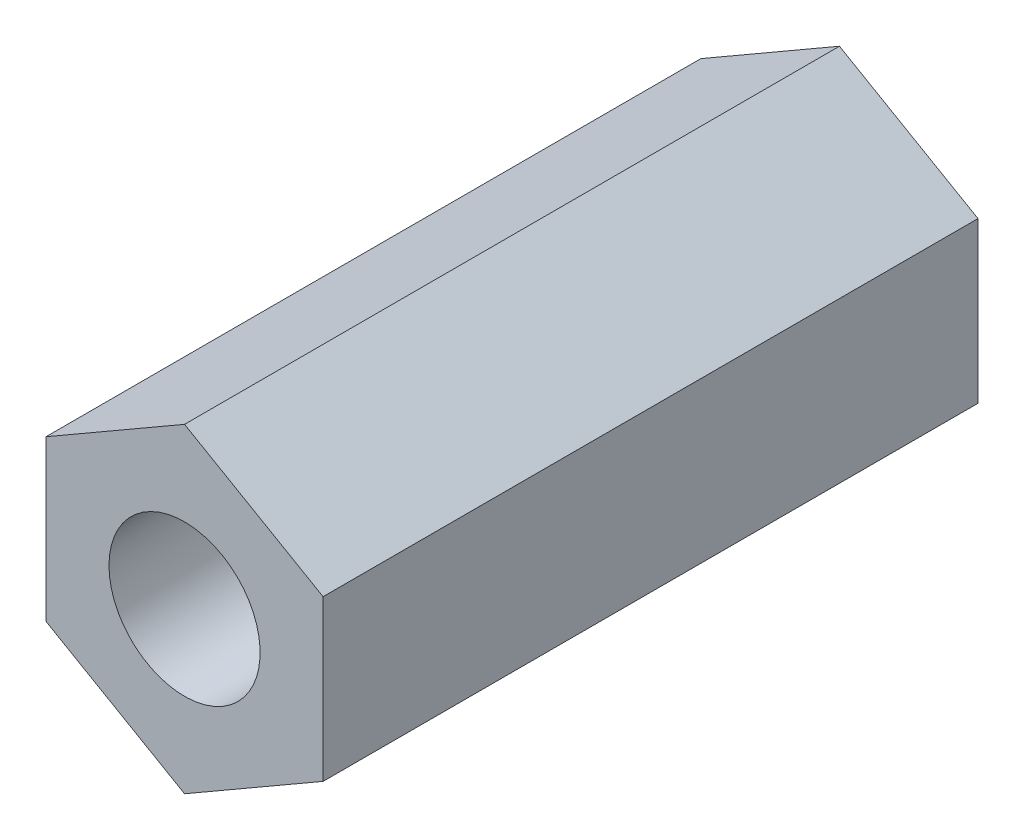
ISO-10303-21;
HEADER;
FILE_DESCRIPTION(('STEP AP214'),'2;1');
FILE_NAME('part.step','',(''),(''),'','','');
FILE_SCHEMA(('AUTOMOTIVE_DESIGN { 1 0 10303 214 1 1 1 1 }'));
ENDSEC;
DATA;
#1=APPLICATION_CONTEXT('core data for automotive mechanical design processes');
#2=APPLICATION_PROTOCOL_DEFINITION('international standard','automotive_design',2000,#1);
#3=PRODUCT_CONTEXT('',#1,'mechanical');
#4=PRODUCT('Part','Part','',(#3));
#5=PRODUCT_RELATED_PRODUCT_CATEGORY('part','',(#4));
#6=PRODUCT_DEFINITION_FORMATION('','',#4);
#7=PRODUCT_DEFINITION_CONTEXT('part definition',#1,'design');
#8=PRODUCT_DEFINITION('design','',#6,#7);
#9=PRODUCT_DEFINITION_SHAPE('','',#8);
#10=(LENGTH_UNIT() NAMED_UNIT(*) SI_UNIT(.MILLI.,.METRE.));
#11=(NAMED_UNIT(*) PLANE_ANGLE_UNIT() SI_UNIT($,.RADIAN.));
#12=(NAMED_UNIT(*) SI_UNIT($,.STERADIAN.) SOLID_ANGLE_UNIT());
#13=UNCERTAINTY_MEASURE_WITH_UNIT(LENGTH_MEASURE(1.E-05),#10,'distance_accuracy_value','');
#14=(GEOMETRIC_REPRESENTATION_CONTEXT(3) GLOBAL_UNCERTAINTY_ASSIGNED_CONTEXT((#13)) GLOBAL_UNIT_ASSIGNED_CONTEXT((#10,
#11,#12)) REPRESENTATION_CONTEXT('',''));
#15=CARTESIAN_POINT('',(0.,0.,0.));
#16=DIRECTION('',(0.,0.,1.));
#17=DIRECTION('',(1.,0.,0.));
#18=AXIS2_PLACEMENT_3D('',#15,#16,#17);
#19=CARTESIAN_POINT('',(0.,0.,13.));
#20=DIRECTION('',(0.,0.,1.));
#21=DIRECTION('',(1.,0.,0.));
#22=AXIS2_PLACEMENT_3D('',#19,#20,#21);
#23=PLANE('',#22);
#24=DIRECTION('',(0.866025403784439,-0.5,0.));
#25=VECTOR('',#24,1.);
#26=CARTESIAN_POINT('',(-2.75,-1.58771324027147,13.));
#27=LINE('',#26,#25);
#28=CARTESIAN_POINT('',(-2.75,-1.58771324027147,13.));
#29=VERTEX_POINT('',#28);
#30=CARTESIAN_POINT('',(0.,-3.17542648054294,13.));
#31=VERTEX_POINT('',#30);
#32=EDGE_CURVE('E148',#29,#31,#27,.T.);
#33=ORIENTED_EDGE('',*,*,#32,.T.);
#34=DIRECTION('',(0.866025403784438,0.5,0.));
#35=VECTOR('',#34,1.);
#36=CARTESIAN_POINT('',(0.,-3.17542648054294,13.));
#37=LINE('',#36,#35);
#38=CARTESIAN_POINT('',(2.75,-1.58771324027147,13.));
#39=VERTEX_POINT('',#38);
#40=EDGE_CURVE('E96',#31,#39,#37,.T.);
#41=ORIENTED_EDGE('',*,*,#40,.T.);
#42=DIRECTION('',(0.,1.,0.));
#43=VECTOR('',#42,1.);
#44=CARTESIAN_POINT('',(2.75,-1.58771324027147,13.));
#45=LINE('',#44,#43);
#46=CARTESIAN_POINT('',(2.75,1.58771324027147,13.));
#47=VERTEX_POINT('',#46);
#48=EDGE_CURVE('E109',#39,#47,#45,.T.);
#49=ORIENTED_EDGE('',*,*,#48,.T.);
#50=DIRECTION('',(-0.866025403784438,0.5,0.));
#51=VECTOR('',#50,1.);
#52=CARTESIAN_POINT('',(2.75,1.58771324027147,13.));
#53=LINE('',#52,#51);
#54=CARTESIAN_POINT('',(0.,3.17542648054294,13.));
#55=VERTEX_POINT('',#54);
#56=EDGE_CURVE('E103',#47,#55,#53,.T.);
#57=ORIENTED_EDGE('',*,*,#56,.T.);
#58=DIRECTION('',(-0.866025403784438,-0.5,0.));
#59=VECTOR('',#58,1.);
#60=CARTESIAN_POINT('',(0.,3.17542648054294,13.));
#61=LINE('',#60,#59);
#62=CARTESIAN_POINT('',(-2.75,1.58771324027147,13.));
#63=VERTEX_POINT('',#62);
#64=EDGE_CURVE('E107',#55,#63,#61,.T.);
#65=ORIENTED_EDGE('',*,*,#64,.T.);
#66=DIRECTION('',(0.,-1.,0.));
#67=VECTOR('',#66,1.);
#68=CARTESIAN_POINT('',(-2.75,1.58771324027147,13.));
#69=LINE('',#68,#67);
#70=EDGE_CURVE('E59',#63,#29,#69,.T.);
#71=ORIENTED_EDGE('',*,*,#70,.T.);
#72=EDGE_LOOP('',(#33,#41,#49,#57,#65,#71));
#73=FACE_BOUND('',#72,.T.);
#74=CARTESIAN_POINT('',(0.,0.,13.));
#75=DIRECTION('',(0.,0.,1.));
#76=DIRECTION('',(1.,0.,0.));
#77=AXIS2_PLACEMENT_3D('',#74,#75,#76);
#78=CIRCLE('',#77,1.5);
#79=CARTESIAN_POINT('',(-1.5,0.,13.));
#80=VERTEX_POINT('',#79);
#81=EDGE_CURVE('E136',#80,#80,#78,.T.);
#82=ORIENTED_EDGE('',*,*,#81,.F.);
#83=EDGE_LOOP('',(#82));
#84=FACE_BOUND('',#83,.T.);
#85=ADVANCED_FACE('F41',(#73,#84),#23,.T.);
#86=CARTESIAN_POINT('',(0.,0.,0.));
#87=DIRECTION('',(0.,0.,1.));
#88=DIRECTION('',(1.,0.,0.));
#89=AXIS2_PLACEMENT_3D('',#86,#87,#88);
#90=PLANE('',#89);
#91=DIRECTION('',(0.866025403784439,-0.5,0.));
#92=VECTOR('',#91,1.);
#93=CARTESIAN_POINT('',(-2.75,-1.58771324027147,0.));
#94=LINE('',#93,#92);
#95=CARTESIAN_POINT('',(-2.75,-1.58771324027147,0.));
#96=VERTEX_POINT('',#95);
#97=CARTESIAN_POINT('',(0.,-3.17542648054294,0.));
#98=VERTEX_POINT('',#97);
#99=EDGE_CURVE('E131',#96,#98,#94,.T.);
#100=ORIENTED_EDGE('',*,*,#99,.F.);
#101=DIRECTION('',(0.,-1.,0.));
#102=VECTOR('',#101,1.);
#103=CARTESIAN_POINT('',(-2.75,1.58771324027147,0.));
#104=LINE('',#103,#102);
#105=CARTESIAN_POINT('',(-2.75,1.58771324027147,0.));
#106=VERTEX_POINT('',#105);
#107=EDGE_CURVE('E88',#106,#96,#104,.T.);
#108=ORIENTED_EDGE('',*,*,#107,.F.);
#109=DIRECTION('',(-0.866025403784438,-0.5,0.));
#110=VECTOR('',#109,1.);
#111=CARTESIAN_POINT('',(0.,3.17542648054294,0.));
#112=LINE('',#111,#110);
#113=CARTESIAN_POINT('',(0.,3.17542648054294,0.));
#114=VERTEX_POINT('',#113);
#115=EDGE_CURVE('E82',#114,#106,#112,.T.);
#116=ORIENTED_EDGE('',*,*,#115,.F.);
#117=DIRECTION('',(-0.866025403784438,0.5,0.));
#118=VECTOR('',#117,1.);
#119=CARTESIAN_POINT('',(2.75,1.58771324027147,0.));
#120=LINE('',#119,#118);
#121=CARTESIAN_POINT('',(2.75,1.58771324027147,0.));
#122=VERTEX_POINT('',#121);
#123=EDGE_CURVE('E118',#122,#114,#120,.T.);
#124=ORIENTED_EDGE('',*,*,#123,.F.);
#125=DIRECTION('',(0.,1.,0.));
#126=VECTOR('',#125,1.);
#127=CARTESIAN_POINT('',(2.75,-1.58771324027147,0.));
#128=LINE('',#127,#126);
#129=CARTESIAN_POINT('',(2.75,-1.58771324027147,0.));
#130=VERTEX_POINT('',#129);
#131=EDGE_CURVE('E139',#130,#122,#128,.T.);
#132=ORIENTED_EDGE('',*,*,#131,.F.);
#133=DIRECTION('',(0.866025403784438,0.5,0.));
#134=VECTOR('',#133,1.);
#135=CARTESIAN_POINT('',(0.,-3.17542648054294,0.));
#136=LINE('',#135,#134);
#137=EDGE_CURVE('E135',#98,#130,#136,.T.);
#138=ORIENTED_EDGE('',*,*,#137,.F.);
#139=EDGE_LOOP('',(#100,#108,#116,#124,#132,#138));
#140=FACE_BOUND('',#139,.T.);
#141=CARTESIAN_POINT('',(0.,0.,0.));
#142=DIRECTION('',(0.,0.,1.));
#143=DIRECTION('',(1.,0.,0.));
#144=AXIS2_PLACEMENT_3D('',#141,#142,#143);
#145=CIRCLE('',#144,1.5);
#146=CARTESIAN_POINT('',(-1.5,0.,0.));
#147=VERTEX_POINT('',#146);
#148=EDGE_CURVE('E245',#147,#147,#145,.T.);
#149=ORIENTED_EDGE('',*,*,#148,.T.);
#150=EDGE_LOOP('',(#149));
#151=FACE_BOUND('',#150,.T.);
#152=ADVANCED_FACE('F161',(#140,#151),#90,.F.);
#153=CARTESIAN_POINT('',(-2.75,-1.58771324027147,13.));
#154=DIRECTION('',(0.5,0.866025403784439,0.));
#155=DIRECTION('',(-0.866025403784439,0.5,0.));
#156=AXIS2_PLACEMENT_3D('',#153,#154,#155);
#157=PLANE('',#156);
#158=ORIENTED_EDGE('',*,*,#99,.T.);
#159=DIRECTION('',(0.,0.,-1.));
#160=VECTOR('',#159,1.);
#161=CARTESIAN_POINT('',(0.,-3.17542648054294,13.));
#162=LINE('',#161,#160);
#163=EDGE_CURVE('E11',#31,#98,#162,.T.);
#164=ORIENTED_EDGE('',*,*,#163,.F.);
#165=ORIENTED_EDGE('',*,*,#32,.F.);
#166=DIRECTION('',(0.,0.,-1.));
#167=VECTOR('',#166,1.);
#168=CARTESIAN_POINT('',(-2.75,-1.58771324027147,13.));
#169=LINE('',#168,#167);
#170=EDGE_CURVE('E127',#29,#96,#169,.T.);
#171=ORIENTED_EDGE('',*,*,#170,.T.);
#172=EDGE_LOOP('',(#158,#164,#165,#171));
#173=FACE_BOUND('',#172,.T.);
#174=ADVANCED_FACE('F43',(#173),#157,.F.);
#175=CARTESIAN_POINT('',(0.,-3.17542648054294,13.));
#176=DIRECTION('',(-0.5,0.866025403784438,0.));
#177=DIRECTION('',(-0.866025403784439,-0.5,0.));
#178=AXIS2_PLACEMENT_3D('',#175,#176,#177);
#179=PLANE('',#178);
#180=ORIENTED_EDGE('',*,*,#137,.T.);
#181=DIRECTION('',(0.,0.,-1.));
#182=VECTOR('',#181,1.);
#183=CARTESIAN_POINT('',(2.75,-1.58771324027147,13.));
#184=LINE('',#183,#182);
#185=EDGE_CURVE('E51',#39,#130,#184,.T.);
#186=ORIENTED_EDGE('',*,*,#185,.F.);
#187=ORIENTED_EDGE('',*,*,#40,.F.);
#188=ORIENTED_EDGE('',*,*,#163,.T.);
#189=EDGE_LOOP('',(#180,#186,#187,#188));
#190=FACE_BOUND('',#189,.T.);
#191=ADVANCED_FACE('F186',(#190),#179,.F.);
#192=CARTESIAN_POINT('',(2.75,-1.58771324027147,13.));
#193=DIRECTION('',(-1.,0.,0.));
#194=DIRECTION('',(0.,0.,1.));
#195=AXIS2_PLACEMENT_3D('',#192,#193,#194);
#196=PLANE('',#195);
#197=ORIENTED_EDGE('',*,*,#131,.T.);
#198=DIRECTION('',(0.,0.,-1.));
#199=VECTOR('',#198,1.);
#200=CARTESIAN_POINT('',(2.75,1.58771324027147,13.));
#201=LINE('',#200,#199);
#202=EDGE_CURVE('E120',#47,#122,#201,.T.);
#203=ORIENTED_EDGE('',*,*,#202,.F.);
#204=ORIENTED_EDGE('',*,*,#48,.F.);
#205=ORIENTED_EDGE('',*,*,#185,.T.);
#206=EDGE_LOOP('',(#197,#203,#204,#205));
#207=FACE_BOUND('',#206,.T.);
#208=ADVANCED_FACE('F158',(#207),#196,.F.);
#209=CARTESIAN_POINT('',(2.75,1.58771324027147,13.));
#210=DIRECTION('',(-0.5,-0.866025403784439,0.));
#211=DIRECTION('',(0.866025403784439,-0.5,0.));
#212=AXIS2_PLACEMENT_3D('',#209,#210,#211);
#213=PLANE('',#212);
#214=ORIENTED_EDGE('',*,*,#123,.T.);
#215=DIRECTION('',(0.,0.,-1.));
#216=VECTOR('',#215,1.);
#217=CARTESIAN_POINT('',(0.,3.17542648054294,13.));
#218=LINE('',#217,#216);
#219=EDGE_CURVE('E115',#55,#114,#218,.T.);
#220=ORIENTED_EDGE('',*,*,#219,.F.);
#221=ORIENTED_EDGE('',*,*,#56,.F.);
#222=ORIENTED_EDGE('',*,*,#202,.T.);
#223=EDGE_LOOP('',(#214,#220,#221,#222));
#224=FACE_BOUND('',#223,.T.);
#225=ADVANCED_FACE('F116',(#224),#213,.F.);
#226=CARTESIAN_POINT('',(0.,3.17542648054294,13.));
#227=DIRECTION('',(0.5,-0.866025403784438,0.));
#228=DIRECTION('',(0.866025403784439,0.5,0.));
#229=AXIS2_PLACEMENT_3D('',#226,#227,#228);
#230=PLANE('',#229);
#231=ORIENTED_EDGE('',*,*,#115,.T.);
#232=DIRECTION('',(0.,0.,-1.));
#233=VECTOR('',#232,1.);
#234=CARTESIAN_POINT('',(-2.75,1.58771324027147,13.));
#235=LINE('',#234,#233);
#236=EDGE_CURVE('E121',#63,#106,#235,.T.);
#237=ORIENTED_EDGE('',*,*,#236,.F.);
#238=ORIENTED_EDGE('',*,*,#64,.F.);
#239=ORIENTED_EDGE('',*,*,#219,.T.);
#240=EDGE_LOOP('',(#231,#237,#238,#239));
#241=FACE_BOUND('',#240,.T.);
#242=ADVANCED_FACE('F123',(#241),#230,.F.);
#243=CARTESIAN_POINT('',(-2.75,1.58771324027147,13.));
#244=DIRECTION('',(1.,0.,0.));
#245=DIRECTION('',(0.,0.,-1.));
#246=AXIS2_PLACEMENT_3D('',#243,#244,#245);
#247=PLANE('',#246);
#248=ORIENTED_EDGE('',*,*,#107,.T.);
#249=ORIENTED_EDGE('',*,*,#170,.F.);
#250=ORIENTED_EDGE('',*,*,#70,.F.);
#251=ORIENTED_EDGE('',*,*,#236,.T.);
#252=EDGE_LOOP('',(#248,#249,#250,#251));
#253=FACE_BOUND('',#252,.T.);
#254=ADVANCED_FACE('F166',(#253),#247,.F.);
#255=CARTESIAN_POINT('',(0.,0.,13.));
#256=DIRECTION('',(0.,0.,-1.));
#257=DIRECTION('',(-1.,0.,0.));
#258=AXIS2_PLACEMENT_3D('',#255,#256,#257);
#259=CYLINDRICAL_SURFACE('',#258,1.5);
#260=CARTESIAN_POINT('',(-1.5,0.,13.));
#261=CARTESIAN_POINT('',(-1.5,0.,12.8645833333333));
#262=CARTESIAN_POINT('',(-1.5,0.,12.7291666666667));
#263=CARTESIAN_POINT('',(-1.5,0.,12.4583333333333));
#264=CARTESIAN_POINT('',(-1.5,0.,12.3229166666667));
#265=CARTESIAN_POINT('',(-1.5,0.,12.0520833333333));
#266=CARTESIAN_POINT('',(-1.5,0.,11.9166666666667));
#267=CARTESIAN_POINT('',(-1.5,0.,11.6458333333333));
#268=CARTESIAN_POINT('',(-1.5,0.,11.5104166666667));
#269=CARTESIAN_POINT('',(-1.5,0.,11.2395833333333));
#270=CARTESIAN_POINT('',(-1.5,0.,11.1041666666667));
#271=CARTESIAN_POINT('',(-1.5,0.,10.8333333333333));
#272=CARTESIAN_POINT('',(-1.5,0.,10.6979166666667));
#273=CARTESIAN_POINT('',(-1.5,0.,10.4270833333333));
#274=CARTESIAN_POINT('',(-1.5,0.,10.2916666666667));
#275=CARTESIAN_POINT('',(-1.5,0.,10.0208333333333));
#276=CARTESIAN_POINT('',(-1.5,0.,9.88541666666667));
#277=CARTESIAN_POINT('',(-1.5,0.,9.61458333333333));
#278=CARTESIAN_POINT('',(-1.5,0.,9.47916666666667));
#279=CARTESIAN_POINT('',(-1.5,0.,9.20833333333333));
#280=CARTESIAN_POINT('',(-1.5,0.,9.07291666666666));
#281=CARTESIAN_POINT('',(-1.5,0.,8.80208333333333));
#282=CARTESIAN_POINT('',(-1.5,0.,8.66666666666667));
#283=CARTESIAN_POINT('',(-1.5,0.,8.39583333333333));
#284=CARTESIAN_POINT('',(-1.5,0.,8.26041666666667));
#285=CARTESIAN_POINT('',(-1.5,0.,7.98958333333333));
#286=CARTESIAN_POINT('',(-1.5,0.,7.85416666666667));
#287=CARTESIAN_POINT('',(-1.5,0.,7.58333333333333));
#288=CARTESIAN_POINT('',(-1.5,0.,7.44791666666667));
#289=CARTESIAN_POINT('',(-1.5,0.,7.17708333333333));
#290=CARTESIAN_POINT('',(-1.5,0.,7.04166666666667));
#291=CARTESIAN_POINT('',(-1.5,0.,6.77083333333333));
#292=CARTESIAN_POINT('',(-1.5,0.,6.63541666666667));
#293=CARTESIAN_POINT('',(-1.5,0.,6.36458333333333));
#294=CARTESIAN_POINT('',(-1.5,0.,6.22916666666667));
#295=CARTESIAN_POINT('',(-1.5,0.,5.95833333333333));
#296=CARTESIAN_POINT('',(-1.5,0.,5.82291666666667));
#297=CARTESIAN_POINT('',(-1.5,0.,5.55208333333333));
#298=CARTESIAN_POINT('',(-1.5,0.,5.41666666666667));
#299=CARTESIAN_POINT('',(-1.5,0.,5.14583333333333));
#300=CARTESIAN_POINT('',(-1.5,0.,5.01041666666667));
#301=CARTESIAN_POINT('',(-1.5,0.,4.73958333333333));
#302=CARTESIAN_POINT('',(-1.5,0.,4.60416666666667));
#303=CARTESIAN_POINT('',(-1.5,0.,4.33333333333333));
#304=CARTESIAN_POINT('',(-1.5,0.,4.19791666666667));
#305=CARTESIAN_POINT('',(-1.5,0.,3.92708333333333));
#306=CARTESIAN_POINT('',(-1.5,0.,3.79166666666667));
#307=CARTESIAN_POINT('',(-1.5,0.,3.52083333333333));
#308=CARTESIAN_POINT('',(-1.5,0.,3.38541666666667));
#309=CARTESIAN_POINT('',(-1.5,0.,3.11458333333333));
#310=CARTESIAN_POINT('',(-1.5,0.,2.97916666666667));
#311=CARTESIAN_POINT('',(-1.5,0.,2.70833333333333));
#312=CARTESIAN_POINT('',(-1.5,0.,2.57291666666667));
#313=CARTESIAN_POINT('',(-1.5,0.,2.30208333333333));
#314=CARTESIAN_POINT('',(-1.5,0.,2.16666666666667));
#315=CARTESIAN_POINT('',(-1.5,0.,1.89583333333333));
#316=CARTESIAN_POINT('',(-1.5,0.,1.76041666666667));
#317=CARTESIAN_POINT('',(-1.5,0.,1.48958333333333));
#318=CARTESIAN_POINT('',(-1.5,0.,1.35416666666667));
#319=CARTESIAN_POINT('',(-1.5,0.,1.08333333333333));
#320=CARTESIAN_POINT('',(-1.5,0.,0.947916666666667));
#321=CARTESIAN_POINT('',(-1.5,0.,0.677083333333334));
#322=CARTESIAN_POINT('',(-1.5,0.,0.541666666666667));
#323=CARTESIAN_POINT('',(-1.5,0.,0.270833333333334));
#324=CARTESIAN_POINT('',(-1.5,0.,0.135416666666667));
#325=CARTESIAN_POINT('',(-1.5,0.,0.));
#326=B_SPLINE_CURVE_WITH_KNOTS('',3,(#260,#261,#262,#263,#264,#265,#266,#267,#268,#269,#270,
#271,#272,#273,#274,#275,#276,#277,#278,#279,#280,#281,#282,#283,#284,#285,#286,#287,#288,#289,
#290,#291,#292,#293,#294,#295,#296,#297,#298,#299,#300,#301,#302,#303,#304,#305,#306,#307,#308,
#309,#310,#311,#312,#313,#314,#315,#316,#317,#318,#319,#320,#321,#322,#323,#324,#325),
.UNSPECIFIED.,.F.,.F.,(4,2,2,2,2,2,2,2,2,2,2,2,2,2,2,2,2,2,2,2,2,2,2,2,2,2,2,2,2,2,2,2,4),(0.,
0.40625,0.812500000000001,1.21875,1.625,2.03125,2.4375,2.84375,3.25,3.65625,4.0625,4.46875,
4.875,5.28125,5.6875,6.09375,6.5,6.90625,7.3125,7.71875,8.125,8.53125,8.9375,9.34375,9.75,
10.15625,10.5625,10.96875,11.375,11.78125,12.1875,12.59375,13.),.UNSPECIFIED.);
#327=EDGE_CURVE('BSEAM168',#80,#147,#326,.T.);
#328=ORIENTED_EDGE('',*,*,#81,.T.);
#329=ORIENTED_EDGE('',*,*,#148,.F.);
#330=ORIENTED_EDGE('',*,*,#327,.T.);
#331=ORIENTED_EDGE('',*,*,#327,.F.);
#332=EDGE_LOOP('',(#328,#330,#329,#331));
#333=FACE_BOUND('',#332,.T.);
#334=ADVANCED_FACE('F168',(#333),#259,.F.);
#335=CLOSED_SHELL('',(#85,#152,#174,#191,#208,#225,#242,#254,#334));
#336=MANIFOLD_SOLID_BREP('B2',#335);
#337=ADVANCED_BREP_SHAPE_REPRESENTATION('',(#18,#336),#14);
#338=SHAPE_DEFINITION_REPRESENTATION(#9,#337);
ENDSEC;
END-ISO-10303-21;
